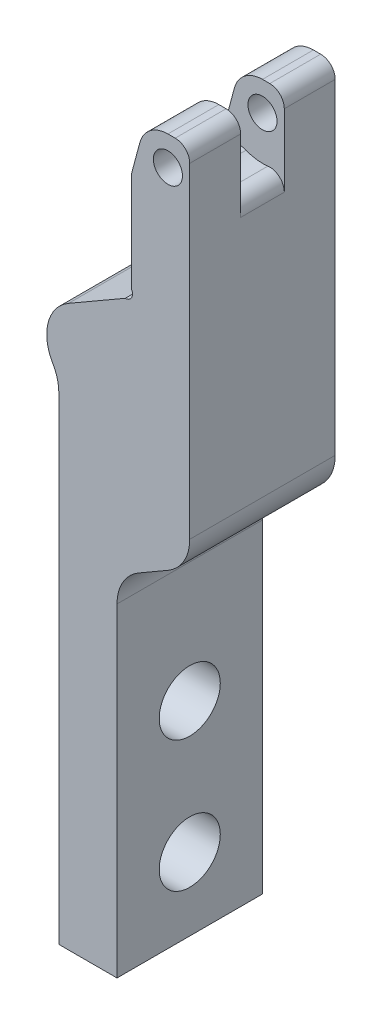
ISO-10303-21;
HEADER;
FILE_DESCRIPTION(('STEP AP214'),'2;1');
FILE_NAME('part.step','',(''),(''),'','','');
FILE_SCHEMA(('AUTOMOTIVE_DESIGN { 1 0 10303 214 1 1 1 1 }'));
ENDSEC;
DATA;
#1=APPLICATION_CONTEXT('core data for automotive mechanical design processes');
#2=APPLICATION_PROTOCOL_DEFINITION('international standard','automotive_design',2000,#1);
#3=PRODUCT_CONTEXT('',#1,'mechanical');
#4=PRODUCT('Part','Part','',(#3));
#5=PRODUCT_RELATED_PRODUCT_CATEGORY('part','',(#4));
#6=PRODUCT_DEFINITION_FORMATION('','',#4);
#7=PRODUCT_DEFINITION_CONTEXT('part definition',#1,'design');
#8=PRODUCT_DEFINITION('design','',#6,#7);
#9=PRODUCT_DEFINITION_SHAPE('','',#8);
#10=(LENGTH_UNIT() NAMED_UNIT(*) SI_UNIT(.MILLI.,.METRE.));
#11=(NAMED_UNIT(*) PLANE_ANGLE_UNIT() SI_UNIT($,.RADIAN.));
#12=(NAMED_UNIT(*) SI_UNIT($,.STERADIAN.) SOLID_ANGLE_UNIT());
#13=UNCERTAINTY_MEASURE_WITH_UNIT(LENGTH_MEASURE(1.E-05),#10,'distance_accuracy_value','');
#14=(GEOMETRIC_REPRESENTATION_CONTEXT(3) GLOBAL_UNCERTAINTY_ASSIGNED_CONTEXT((#13)) GLOBAL_UNIT_ASSIGNED_CONTEXT((#10,
#11,#12)) REPRESENTATION_CONTEXT('',''));
#15=CARTESIAN_POINT('',(0.,0.,0.));
#16=DIRECTION('',(0.,0.,1.));
#17=DIRECTION('',(1.,0.,0.));
#18=AXIS2_PLACEMENT_3D('',#15,#16,#17);
#19=CARTESIAN_POINT('',(5.,52.,5.));
#20=DIRECTION('',(0.,-1.,0.));
#21=DIRECTION('',(0.,0.,-1.));
#22=AXIS2_PLACEMENT_3D('',#19,#20,#21);
#23=PLANE('',#22);
#24=DIRECTION('',(-1.,0.,0.));
#25=VECTOR('',#24,1.);
#26=CARTESIAN_POINT('',(5.,52.,-1.5));
#27=LINE('',#26,#25);
#28=CARTESIAN_POINT('',(4.,52.,-1.5));
#29=VERTEX_POINT('',#28);
#30=CARTESIAN_POINT('',(3.5,52.,-1.5));
#31=VERTEX_POINT('',#30);
#32=EDGE_CURVE('E431',#29,#31,#27,.T.);
#33=ORIENTED_EDGE('',*,*,#32,.F.);
#34=DIRECTION('',(0.,0.,-1.));
#35=VECTOR('',#34,1.);
#36=CARTESIAN_POINT('',(4.,52.,5.));
#37=LINE('',#36,#35);
#38=CARTESIAN_POINT('',(4.,52.,-5.));
#39=VERTEX_POINT('',#38);
#40=EDGE_CURVE('E380',#29,#39,#37,.T.);
#41=ORIENTED_EDGE('',*,*,#40,.T.);
#42=DIRECTION('',(-1.,0.,0.));
#43=VECTOR('',#42,1.);
#44=CARTESIAN_POINT('',(5.,52.,-5.));
#45=LINE('',#44,#43);
#46=CARTESIAN_POINT('',(3.5,52.,-5.));
#47=VERTEX_POINT('',#46);
#48=EDGE_CURVE('E306',#39,#47,#45,.T.);
#49=ORIENTED_EDGE('',*,*,#48,.T.);
#50=DIRECTION('',(0.,0.,1.));
#51=VECTOR('',#50,1.);
#52=CARTESIAN_POINT('',(3.5,52.,-5.));
#53=LINE('',#52,#51);
#54=EDGE_CURVE('E235',#47,#31,#53,.T.);
#55=ORIENTED_EDGE('',*,*,#54,.T.);
#56=EDGE_LOOP('',(#33,#41,#49,#55));
#57=FACE_BOUND('',#56,.T.);
#58=ADVANCED_FACE('F35',(#57),#23,.F.);
#59=CARTESIAN_POINT('',(5.,26.8867513459481,5.));
#60=DIRECTION('',(-1.,0.,0.));
#61=DIRECTION('',(0.,-1.,0.));
#62=AXIS2_PLACEMENT_3D('',#59,#60,#61);
#63=PLANE('',#62);
#64=DIRECTION('',(0.,0.,1.));
#65=VECTOR('',#64,1.);
#66=CARTESIAN_POINT('',(5.,46.0313730334031,5.));
#67=LINE('',#66,#65);
#68=CARTESIAN_POINT('',(5.,46.0313730334031,-1.5));
#69=VERTEX_POINT('',#68);
#70=CARTESIAN_POINT('',(5.,46.0313730334031,1.5));
#71=VERTEX_POINT('',#70);
#72=EDGE_CURVE('E377',#69,#71,#67,.T.);
#73=ORIENTED_EDGE('',*,*,#72,.T.);
#74=DIRECTION('',(0.,1.,0.));
#75=VECTOR('',#74,1.);
#76=CARTESIAN_POINT('',(5.,26.8867513459481,1.5));
#77=LINE('',#76,#75);
#78=CARTESIAN_POINT('',(5.,51.,1.5));
#79=VERTEX_POINT('',#78);
#80=EDGE_CURVE('E218',#71,#79,#77,.T.);
#81=ORIENTED_EDGE('',*,*,#80,.T.);
#82=DIRECTION('',(0.,0.,-1.));
#83=VECTOR('',#82,1.);
#84=CARTESIAN_POINT('',(5.,51.,5.));
#85=LINE('',#84,#83);
#86=CARTESIAN_POINT('',(5.,51.,5.));
#87=VERTEX_POINT('',#86);
#88=EDGE_CURVE('E373',#79,#87,#85,.F.);
#89=ORIENTED_EDGE('',*,*,#88,.T.);
#90=DIRECTION('',(0.,1.,0.));
#91=VECTOR('',#90,1.);
#92=CARTESIAN_POINT('',(5.,26.8867513459481,5.));
#93=LINE('',#92,#91);
#94=CARTESIAN_POINT('',(5.,28.618802153517,5.));
#95=VERTEX_POINT('',#94);
#96=EDGE_CURVE('E279',#95,#87,#93,.T.);
#97=ORIENTED_EDGE('',*,*,#96,.F.);
#98=DIRECTION('',(0.,0.,-1.));
#99=VECTOR('',#98,1.);
#100=CARTESIAN_POINT('',(5.,28.618802153517,5.));
#101=LINE('',#100,#99);
#102=CARTESIAN_POINT('',(5.,28.618802153517,-5.));
#103=VERTEX_POINT('',#102);
#104=EDGE_CURVE('E355',#95,#103,#101,.T.);
#105=ORIENTED_EDGE('',*,*,#104,.T.);
#106=DIRECTION('',(0.,1.,0.));
#107=VECTOR('',#106,1.);
#108=CARTESIAN_POINT('',(5.,26.8867513459481,-5.));
#109=LINE('',#108,#107);
#110=CARTESIAN_POINT('',(5.,51.,-5.));
#111=VERTEX_POINT('',#110);
#112=EDGE_CURVE('E303',#103,#111,#109,.T.);
#113=ORIENTED_EDGE('',*,*,#112,.T.);
#114=DIRECTION('',(0.,0.,-1.));
#115=VECTOR('',#114,1.);
#116=CARTESIAN_POINT('',(5.,51.,5.));
#117=LINE('',#116,#115);
#118=CARTESIAN_POINT('',(5.,51.,-1.5));
#119=VERTEX_POINT('',#118);
#120=EDGE_CURVE('E375',#111,#119,#117,.F.);
#121=ORIENTED_EDGE('',*,*,#120,.T.);
#122=DIRECTION('',(0.,1.,0.));
#123=VECTOR('',#122,1.);
#124=CARTESIAN_POINT('',(5.,26.8867513459481,-1.5));
#125=LINE('',#124,#123);
#126=EDGE_CURVE('E416',#69,#119,#125,.T.);
#127=ORIENTED_EDGE('',*,*,#126,.F.);
#128=EDGE_LOOP('',(#73,#81,#89,#97,#105,#113,#121,#127));
#129=FACE_BOUND('',#128,.T.);
#130=ADVANCED_FACE('F451',(#129),#63,.F.);
#131=CARTESIAN_POINT('',(1.,41.,5.));
#132=DIRECTION('',(1.,0.,0.));
#133=DIRECTION('',(0.,0.,-1.));
#134=AXIS2_PLACEMENT_3D('',#131,#132,#133);
#135=PLANE('',#134);
#136=DIRECTION('',(0.,0.,1.));
#137=VECTOR('',#136,1.);
#138=CARTESIAN_POINT('',(1.,46.2919007564522,5.));
#139=LINE('',#138,#137);
#140=CARTESIAN_POINT('',(1.,46.2919007564522,1.5));
#141=VERTEX_POINT('',#140);
#142=CARTESIAN_POINT('',(1.,46.2919007564522,-1.5));
#143=VERTEX_POINT('',#142);
#144=EDGE_CURVE('E366',#141,#143,#139,.F.);
#145=ORIENTED_EDGE('',*,*,#144,.T.);
#146=DIRECTION('',(0.,-1.,0.));
#147=VECTOR('',#146,1.);
#148=CARTESIAN_POINT('',(1.,41.,-1.5));
#149=LINE('',#148,#147);
#150=CARTESIAN_POINT('',(1.,48.3972795913903,-1.5));
#151=VERTEX_POINT('',#150);
#152=EDGE_CURVE('E429',#151,#143,#149,.T.);
#153=ORIENTED_EDGE('',*,*,#152,.F.);
#154=DIRECTION('',(0.,0.,1.));
#155=VECTOR('',#154,1.);
#156=CARTESIAN_POINT('',(1.,48.3972795913903,-5.));
#157=LINE('',#156,#155);
#158=CARTESIAN_POINT('',(1.,48.3972795913903,-5.));
#159=VERTEX_POINT('',#158);
#160=EDGE_CURVE('E244',#159,#151,#157,.T.);
#161=ORIENTED_EDGE('',*,*,#160,.F.);
#162=DIRECTION('',(0.,-1.,0.));
#163=VECTOR('',#162,1.);
#164=CARTESIAN_POINT('',(1.,41.,-5.));
#165=LINE('',#164,#163);
#166=CARTESIAN_POINT('',(1.,41.5,-5.));
#167=VERTEX_POINT('',#166);
#168=EDGE_CURVE('E308',#159,#167,#165,.T.);
#169=ORIENTED_EDGE('',*,*,#168,.T.);
#170=DIRECTION('',(0.,0.,1.));
#171=VECTOR('',#170,1.);
#172=CARTESIAN_POINT('',(1.,41.5,-5.));
#173=LINE('',#172,#171);
#174=CARTESIAN_POINT('',(1.,41.5,5.));
#175=VERTEX_POINT('',#174);
#176=EDGE_CURVE('E260',#167,#175,#173,.T.);
#177=ORIENTED_EDGE('',*,*,#176,.T.);
#178=DIRECTION('',(0.,-1.,0.));
#179=VECTOR('',#178,1.);
#180=CARTESIAN_POINT('',(1.,41.,5.));
#181=LINE('',#180,#179);
#182=CARTESIAN_POINT('',(1.,48.3972795913903,5.));
#183=VERTEX_POINT('',#182);
#184=EDGE_CURVE('E284',#183,#175,#181,.T.);
#185=ORIENTED_EDGE('',*,*,#184,.F.);
#186=CARTESIAN_POINT('',(1.,48.3972795913903,1.5));
#187=VERTEX_POINT('',#186);
#188=EDGE_CURVE('E239',#187,#183,#157,.T.);
#189=ORIENTED_EDGE('',*,*,#188,.F.);
#190=DIRECTION('',(0.,-1.,0.));
#191=VECTOR('',#190,1.);
#192=CARTESIAN_POINT('',(1.,41.,1.5));
#193=LINE('',#192,#191);
#194=EDGE_CURVE('E219',#187,#141,#193,.T.);
#195=ORIENTED_EDGE('',*,*,#194,.T.);
#196=EDGE_LOOP('',(#145,#153,#161,#169,#177,#185,#189,#195));
#197=FACE_BOUND('',#196,.T.);
#198=ADVANCED_FACE('F482',(#197),#135,.F.);
#199=CARTESIAN_POINT('',(3.5,50.,-5.));
#200=DIRECTION('',(0.,0.,1.));
#201=DIRECTION('',(1.,0.,0.));
#202=AXIS2_PLACEMENT_3D('',#199,#200,#201);
#203=CYLINDRICAL_SURFACE('',#202,1.);
#204=CARTESIAN_POINT('',(3.5,50.,-5.));
#205=DIRECTION('',(0.,0.,1.));
#206=DIRECTION('',(1.,0.,0.));
#207=AXIS2_PLACEMENT_3D('',#204,#205,#206);
#208=CIRCLE('',#207,1.);
#209=CARTESIAN_POINT('',(4.5,50.,-5.));
#210=VERTEX_POINT('',#209);
#211=EDGE_CURVE('E251',#210,#210,#208,.T.);
#212=ORIENTED_EDGE('',*,*,#211,.F.);
#213=EDGE_LOOP('',(#212));
#214=FACE_BOUND('',#213,.T.);
#215=CARTESIAN_POINT('',(3.5,50.,-1.5));
#216=DIRECTION('',(0.,0.,1.));
#217=DIRECTION('',(1.,0.,0.));
#218=AXIS2_PLACEMENT_3D('',#215,#216,#217);
#219=CIRCLE('',#218,1.);
#220=CARTESIAN_POINT('',(4.5,50.,-1.5));
#221=VERTEX_POINT('',#220);
#222=EDGE_CURVE('E250',#221,#221,#219,.F.);
#223=ORIENTED_EDGE('',*,*,#222,.F.);
#224=EDGE_LOOP('',(#223));
#225=FACE_BOUND('',#224,.T.);
#226=ADVANCED_FACE('F560',(#214,#225),#203,.F.);
#227=CARTESIAN_POINT('',(1.56814834742186,50.517638090205,-5.));
#228=DIRECTION('',(0.96592582628907,-0.258819045102514,0.));
#229=DIRECTION('',(0.258819045102514,0.96592582628907,0.));
#230=AXIS2_PLACEMENT_3D('',#227,#228,#229);
#231=PLANE('',#230);
#232=DIRECTION('',(-0.258819045102514,-0.96592582628907,0.));
#233=VECTOR('',#232,1.);
#234=CARTESIAN_POINT('',(1.56814834742186,50.517638090205,-1.5));
#235=LINE('',#234,#233);
#236=CARTESIAN_POINT('',(1.56814834742186,50.517638090205,-1.5));
#237=VERTEX_POINT('',#236);
#238=EDGE_CURVE('E427',#237,#151,#235,.T.);
#239=ORIENTED_EDGE('',*,*,#238,.F.);
#240=DIRECTION('',(0.,0.,1.));
#241=VECTOR('',#240,1.);
#242=CARTESIAN_POINT('',(1.56814834742186,50.517638090205,-5.));
#243=LINE('',#242,#241);
#244=CARTESIAN_POINT('',(1.56814834742186,50.517638090205,-5.));
#245=VERTEX_POINT('',#244);
#246=EDGE_CURVE('E236',#245,#237,#243,.T.);
#247=ORIENTED_EDGE('',*,*,#246,.F.);
#248=DIRECTION('',(0.258819045102514,0.96592582628907,0.));
#249=VECTOR('',#248,1.);
#250=CARTESIAN_POINT('',(1.56814834742186,50.517638090205,-5.));
#251=LINE('',#250,#249);
#252=EDGE_CURVE('E436',#159,#245,#251,.T.);
#253=ORIENTED_EDGE('',*,*,#252,.F.);
#254=ORIENTED_EDGE('',*,*,#160,.T.);
#255=EDGE_LOOP('',(#239,#247,#253,#254));
#256=FACE_BOUND('',#255,.T.);
#257=ADVANCED_FACE('F477',(#256),#231,.F.);
#258=CARTESIAN_POINT('',(3.5,50.,-5.));
#259=DIRECTION('',(0.,0.,1.));
#260=DIRECTION('',(1.,0.,0.));
#261=AXIS2_PLACEMENT_3D('',#258,#259,#260);
#262=CYLINDRICAL_SURFACE('',#261,2.);
#263=CARTESIAN_POINT('',(3.5,50.,-1.5));
#264=DIRECTION('',(0.,0.,1.));
#265=DIRECTION('',(1.,0.,0.));
#266=AXIS2_PLACEMENT_3D('',#263,#264,#265);
#267=CIRCLE('',#266,2.);
#268=EDGE_CURVE('E229',#31,#237,#267,.T.);
#269=ORIENTED_EDGE('',*,*,#268,.F.);
#270=ORIENTED_EDGE('',*,*,#54,.F.);
#271=CARTESIAN_POINT('',(3.5,50.,-5.));
#272=DIRECTION('',(0.,0.,-1.));
#273=DIRECTION('',(-1.,0.,0.));
#274=AXIS2_PLACEMENT_3D('',#271,#272,#273);
#275=CIRCLE('',#274,2.);
#276=EDGE_CURVE('E439',#245,#47,#275,.T.);
#277=ORIENTED_EDGE('',*,*,#276,.F.);
#278=ORIENTED_EDGE('',*,*,#246,.T.);
#279=EDGE_LOOP('',(#269,#270,#277,#278));
#280=FACE_BOUND('',#279,.T.);
#281=ADVANCED_FACE('F474',(#280),#262,.T.);
#282=DIRECTION('',(-1.,0.,0.));
#283=VECTOR('',#282,1.);
#284=CARTESIAN_POINT('',(5.,52.,5.));
#285=LINE('',#284,#283);
#286=CARTESIAN_POINT('',(4.,52.,5.));
#287=VERTEX_POINT('',#286);
#288=CARTESIAN_POINT('',(3.5,52.,5.));
#289=VERTEX_POINT('',#288);
#290=EDGE_CURVE('E282',#287,#289,#285,.T.);
#291=ORIENTED_EDGE('',*,*,#290,.F.);
#292=DIRECTION('',(0.,0.,-1.));
#293=VECTOR('',#292,1.);
#294=CARTESIAN_POINT('',(4.,52.,5.));
#295=LINE('',#294,#293);
#296=CARTESIAN_POINT('',(4.,52.,1.5));
#297=VERTEX_POINT('',#296);
#298=EDGE_CURVE('E216',#287,#297,#295,.T.);
#299=ORIENTED_EDGE('',*,*,#298,.T.);
#300=DIRECTION('',(-1.,0.,0.));
#301=VECTOR('',#300,1.);
#302=CARTESIAN_POINT('',(5.,52.,1.5));
#303=LINE('',#302,#301);
#304=CARTESIAN_POINT('',(3.5,52.,1.5));
#305=VERTEX_POINT('',#304);
#306=EDGE_CURVE('E210',#297,#305,#303,.T.);
#307=ORIENTED_EDGE('',*,*,#306,.T.);
#308=EDGE_CURVE('E214',#305,#289,#53,.T.);
#309=ORIENTED_EDGE('',*,*,#308,.T.);
#310=EDGE_LOOP('',(#291,#299,#307,#309));
#311=FACE_BOUND('',#310,.T.);
#312=ADVANCED_FACE('F212',(#311),#23,.F.);
#313=CARTESIAN_POINT('',(0.,24.,5.));
#314=DIRECTION('',(-0.499999999999999,0.866025403784439,0.));
#315=DIRECTION('',(-0.866025403784439,-0.499999999999999,0.));
#316=AXIS2_PLACEMENT_3D('',#313,#314,#315);
#317=PLANE('',#316);
#318=DIRECTION('',(0.866025403784439,0.499999999999999,0.));
#319=VECTOR('',#318,1.);
#320=CARTESIAN_POINT('',(0.,24.,5.));
#321=LINE('',#320,#319);
#322=CARTESIAN_POINT('',(1.5,24.8660254037844,5.));
#323=VERTEX_POINT('',#322);
#324=CARTESIAN_POINT('',(3.5,26.0207259421637,5.));
#325=VERTEX_POINT('',#324);
#326=EDGE_CURVE('E276',#323,#325,#321,.T.);
#327=ORIENTED_EDGE('',*,*,#326,.F.);
#328=DIRECTION('',(0.,0.,-1.));
#329=VECTOR('',#328,1.);
#330=CARTESIAN_POINT('',(1.5,24.8660254037844,-5.));
#331=LINE('',#330,#329);
#332=CARTESIAN_POINT('',(1.5,24.8660254037844,-5.));
#333=VERTEX_POINT('',#332);
#334=EDGE_CURVE('E350',#323,#333,#331,.T.);
#335=ORIENTED_EDGE('',*,*,#334,.T.);
#336=DIRECTION('',(0.866025403784439,0.499999999999999,0.));
#337=VECTOR('',#336,1.);
#338=CARTESIAN_POINT('',(0.,24.,-5.));
#339=LINE('',#338,#337);
#340=CARTESIAN_POINT('',(3.5,26.0207259421637,-5.));
#341=VERTEX_POINT('',#340);
#342=EDGE_CURVE('E275',#333,#341,#339,.T.);
#343=ORIENTED_EDGE('',*,*,#342,.T.);
#344=DIRECTION('',(0.,0.,-1.));
#345=VECTOR('',#344,1.);
#346=CARTESIAN_POINT('',(3.5,26.0207259421637,5.));
#347=LINE('',#346,#345);
#348=EDGE_CURVE('E348',#341,#325,#347,.F.);
#349=ORIENTED_EDGE('',*,*,#348,.T.);
#350=EDGE_LOOP('',(#327,#335,#343,#349));
#351=FACE_BOUND('',#350,.T.);
#352=ADVANCED_FACE('F527',(#351),#317,.F.);
#353=CARTESIAN_POINT('',(-5.92820323027552,37.,5.));
#354=DIRECTION('',(0.499999999999998,-0.86602540378444,0.));
#355=DIRECTION('',(0.86602540378444,0.499999999999998,0.));
#356=AXIS2_PLACEMENT_3D('',#353,#354,#355);
#357=PLANE('',#356);
#358=DIRECTION('',(-0.86602540378444,-0.499999999999998,0.));
#359=VECTOR('',#358,1.);
#360=CARTESIAN_POINT('',(-5.92820323027552,37.,-5.));
#361=LINE('',#360,#359);
#362=CARTESIAN_POINT('',(0.566987298107779,40.75,-5.));
#363=VERTEX_POINT('',#362);
#364=CARTESIAN_POINT('',(-3.3301270189222,38.5,-5.));
#365=VERTEX_POINT('',#364);
#366=EDGE_CURVE('E311',#363,#365,#361,.T.);
#367=ORIENTED_EDGE('',*,*,#366,.T.);
#368=DIRECTION('',(0.,0.,-1.));
#369=VECTOR('',#368,1.);
#370=CARTESIAN_POINT('',(-3.3301270189222,38.5,5.));
#371=LINE('',#370,#369);
#372=CARTESIAN_POINT('',(-3.3301270189222,38.5,5.));
#373=VERTEX_POINT('',#372);
#374=EDGE_CURVE('E339',#365,#373,#371,.F.);
#375=ORIENTED_EDGE('',*,*,#374,.T.);
#376=DIRECTION('',(-0.86602540378444,-0.499999999999998,0.));
#377=VECTOR('',#376,1.);
#378=CARTESIAN_POINT('',(-5.92820323027552,37.,5.));
#379=LINE('',#378,#377);
#380=CARTESIAN_POINT('',(0.566987298107779,40.75,5.));
#381=VERTEX_POINT('',#380);
#382=EDGE_CURVE('E287',#381,#373,#379,.T.);
#383=ORIENTED_EDGE('',*,*,#382,.F.);
#384=DIRECTION('',(0.,0.,1.));
#385=VECTOR('',#384,1.);
#386=CARTESIAN_POINT('',(0.566987298107779,40.75,-5.));
#387=LINE('',#386,#385);
#388=EDGE_CURVE('E254',#381,#363,#387,.F.);
#389=ORIENTED_EDGE('',*,*,#388,.T.);
#390=EDGE_LOOP('',(#367,#375,#383,#389));
#391=FACE_BOUND('',#390,.T.);
#392=ADVANCED_FACE('F495',(#391),#357,.F.);
#393=CARTESIAN_POINT('',(-5.92820323027552,37.,5.));
#394=DIRECTION('',(0.86602540378444,0.499999999999998,0.));
#395=DIRECTION('',(-0.499999999999998,0.86602540378444,0.));
#396=AXIS2_PLACEMENT_3D('',#393,#394,#395);
#397=PLANE('',#396);
#398=DIRECTION('',(0.499999999999998,-0.86602540378444,0.));
#399=VECTOR('',#398,1.);
#400=CARTESIAN_POINT('',(-5.92820323027552,37.,5.));
#401=LINE('',#400,#399);
#402=CARTESIAN_POINT('',(-4.42820323027552,34.4019237886467,5.));
#403=VERTEX_POINT('',#402);
#404=CARTESIAN_POINT('',(-4.40192378864669,34.356406460551,5.));
#405=VERTEX_POINT('',#404);
#406=EDGE_CURVE('E290',#403,#405,#401,.T.);
#407=ORIENTED_EDGE('',*,*,#406,.F.);
#408=DIRECTION('',(0.,0.,-1.));
#409=VECTOR('',#408,1.);
#410=CARTESIAN_POINT('',(-4.42820323027552,34.4019237886467,5.));
#411=LINE('',#410,#409);
#412=CARTESIAN_POINT('',(-4.42820323027552,34.4019237886467,-5.));
#413=VERTEX_POINT('',#412);
#414=EDGE_CURVE('E332',#403,#413,#411,.T.);
#415=ORIENTED_EDGE('',*,*,#414,.T.);
#416=DIRECTION('',(0.499999999999998,-0.86602540378444,0.));
#417=VECTOR('',#416,1.);
#418=CARTESIAN_POINT('',(-5.92820323027552,37.,-5.));
#419=LINE('',#418,#417);
#420=CARTESIAN_POINT('',(-4.40192378864669,34.356406460551,-5.));
#421=VERTEX_POINT('',#420);
#422=EDGE_CURVE('E314',#413,#421,#419,.T.);
#423=ORIENTED_EDGE('',*,*,#422,.T.);
#424=DIRECTION('',(0.,0.,-1.));
#425=VECTOR('',#424,1.);
#426=CARTESIAN_POINT('',(-4.40192378864669,34.356406460551,5.));
#427=LINE('',#426,#425);
#428=EDGE_CURVE('E330',#421,#405,#427,.F.);
#429=ORIENTED_EDGE('',*,*,#428,.T.);
#430=EDGE_LOOP('',(#407,#415,#423,#429));
#431=FACE_BOUND('',#430,.T.);
#432=ADVANCED_FACE('F503',(#431),#397,.F.);
#433=CARTESIAN_POINT('',(-4.,33.6602540378444,5.));
#434=DIRECTION('',(1.,0.,0.));
#435=DIRECTION('',(0.,1.,0.));
#436=AXIS2_PLACEMENT_3D('',#433,#434,#435);
#437=PLANE('',#436);
#438=CARTESIAN_POINT('',(-4.,14.,0.));
#439=DIRECTION('',(1.,0.,0.));
#440=DIRECTION('',(0.,1.,0.));
#441=AXIS2_PLACEMENT_3D('',#438,#439,#440);
#442=CIRCLE('',#441,2.1);
#443=CARTESIAN_POINT('',(-4.,16.1,0.));
#444=VERTEX_POINT('',#443);
#445=EDGE_CURVE('E272',#444,#444,#442,.T.);
#446=ORIENTED_EDGE('',*,*,#445,.T.);
#447=EDGE_LOOP('',(#446));
#448=FACE_BOUND('',#447,.T.);
#449=CARTESIAN_POINT('',(-4.,5.,0.));
#450=DIRECTION('',(1.,0.,0.));
#451=DIRECTION('',(0.,1.,0.));
#452=AXIS2_PLACEMENT_3D('',#449,#450,#451);
#453=CIRCLE('',#452,2.1);
#454=CARTESIAN_POINT('',(-4.,7.1,0.));
#455=VERTEX_POINT('',#454);
#456=EDGE_CURVE('E267',#455,#455,#453,.T.);
#457=ORIENTED_EDGE('',*,*,#456,.T.);
#458=EDGE_LOOP('',(#457));
#459=FACE_BOUND('',#458,.T.);
#460=DIRECTION('',(0.,-1.,0.));
#461=VECTOR('',#460,1.);
#462=CARTESIAN_POINT('',(-4.,33.6602540378444,5.));
#463=LINE('',#462,#461);
#464=CARTESIAN_POINT('',(-4.,32.856406460551,5.));
#465=VERTEX_POINT('',#464);
#466=CARTESIAN_POINT('',(-4.,0.,5.));
#467=VERTEX_POINT('',#466);
#468=EDGE_CURVE('E293',#465,#467,#463,.T.);
#469=ORIENTED_EDGE('',*,*,#468,.F.);
#470=DIRECTION('',(0.,0.,-1.));
#471=VECTOR('',#470,1.);
#472=CARTESIAN_POINT('',(-4.,32.856406460551,-5.));
#473=LINE('',#472,#471);
#474=CARTESIAN_POINT('',(-4.,32.856406460551,-5.));
#475=VERTEX_POINT('',#474);
#476=EDGE_CURVE('E345',#465,#475,#473,.T.);
#477=ORIENTED_EDGE('',*,*,#476,.T.);
#478=DIRECTION('',(0.,-1.,0.));
#479=VECTOR('',#478,1.);
#480=CARTESIAN_POINT('',(-4.,33.6602540378444,-5.));
#481=LINE('',#480,#479);
#482=CARTESIAN_POINT('',(-4.,0.,-5.));
#483=VERTEX_POINT('',#482);
#484=EDGE_CURVE('E317',#475,#483,#481,.T.);
#485=ORIENTED_EDGE('',*,*,#484,.T.);
#486=DIRECTION('',(0.,0.,-1.));
#487=VECTOR('',#486,1.);
#488=CARTESIAN_POINT('',(-4.,0.,5.));
#489=LINE('',#488,#487);
#490=EDGE_CURVE('E325',#467,#483,#489,.T.);
#491=ORIENTED_EDGE('',*,*,#490,.F.);
#492=EDGE_LOOP('',(#469,#477,#485,#491));
#493=FACE_BOUND('',#492,.T.);
#494=ADVANCED_FACE('F512',(#448,#459,#493),#437,.F.);
#495=CARTESIAN_POINT('',(-4.,0.,5.));
#496=DIRECTION('',(0.,1.,0.));
#497=DIRECTION('',(0.,0.,1.));
#498=AXIS2_PLACEMENT_3D('',#495,#496,#497);
#499=PLANE('',#498);
#500=DIRECTION('',(1.,0.,0.));
#501=VECTOR('',#500,1.);
#502=CARTESIAN_POINT('',(-4.,0.,-5.));
#503=LINE('',#502,#501);
#504=CARTESIAN_POINT('',(0.,0.,-5.));
#505=VERTEX_POINT('',#504);
#506=EDGE_CURVE('E319',#483,#505,#503,.T.);
#507=ORIENTED_EDGE('',*,*,#506,.T.);
#508=DIRECTION('',(0.,0.,-1.));
#509=VECTOR('',#508,1.);
#510=CARTESIAN_POINT('',(0.,0.,5.));
#511=LINE('',#510,#509);
#512=CARTESIAN_POINT('',(0.,0.,5.));
#513=VERTEX_POINT('',#512);
#514=EDGE_CURVE('E300',#513,#505,#511,.T.);
#515=ORIENTED_EDGE('',*,*,#514,.F.);
#516=DIRECTION('',(1.,0.,0.));
#517=VECTOR('',#516,1.);
#518=CARTESIAN_POINT('',(-4.,0.,5.));
#519=LINE('',#518,#517);
#520=EDGE_CURVE('E295',#467,#513,#519,.T.);
#521=ORIENTED_EDGE('',*,*,#520,.F.);
#522=ORIENTED_EDGE('',*,*,#490,.T.);
#523=EDGE_LOOP('',(#507,#515,#521,#522));
#524=FACE_BOUND('',#523,.T.);
#525=ADVANCED_FACE('F518',(#524),#499,.F.);
#526=CARTESIAN_POINT('',(0.,0.,5.));
#527=DIRECTION('',(-1.,0.,0.));
#528=DIRECTION('',(0.,0.,1.));
#529=AXIS2_PLACEMENT_3D('',#526,#527,#528);
#530=PLANE('',#529);
#531=CARTESIAN_POINT('',(0.,14.,0.));
#532=DIRECTION('',(1.,0.,0.));
#533=DIRECTION('',(0.,0.,-1.));
#534=AXIS2_PLACEMENT_3D('',#531,#532,#533);
#535=CIRCLE('',#534,2.1);
#536=CARTESIAN_POINT('',(0.,14.,-2.1));
#537=VERTEX_POINT('',#536);
#538=EDGE_CURVE('E264',#537,#537,#535,.T.);
#539=ORIENTED_EDGE('',*,*,#538,.F.);
#540=EDGE_LOOP('',(#539));
#541=FACE_BOUND('',#540,.T.);
#542=CARTESIAN_POINT('',(0.,5.,0.));
#543=DIRECTION('',(1.,0.,0.));
#544=DIRECTION('',(0.,0.,-1.));
#545=AXIS2_PLACEMENT_3D('',#542,#543,#544);
#546=CIRCLE('',#545,2.1);
#547=CARTESIAN_POINT('',(0.,5.,-2.1));
#548=VERTEX_POINT('',#547);
#549=EDGE_CURVE('E263',#548,#548,#546,.T.);
#550=ORIENTED_EDGE('',*,*,#549,.F.);
#551=EDGE_LOOP('',(#550));
#552=FACE_BOUND('',#551,.T.);
#553=DIRECTION('',(0.,1.,0.));
#554=VECTOR('',#553,1.);
#555=CARTESIAN_POINT('',(0.,0.,-5.));
#556=LINE('',#555,#554);
#557=CARTESIAN_POINT('',(0.,22.2679491924311,-5.));
#558=VERTEX_POINT('',#557);
#559=EDGE_CURVE('E280',#505,#558,#556,.T.);
#560=ORIENTED_EDGE('',*,*,#559,.T.);
#561=DIRECTION('',(0.,0.,-1.));
#562=VECTOR('',#561,1.);
#563=CARTESIAN_POINT('',(0.,22.2679491924311,5.));
#564=LINE('',#563,#562);
#565=CARTESIAN_POINT('',(0.,22.2679491924311,5.));
#566=VERTEX_POINT('',#565);
#567=EDGE_CURVE('E353',#558,#566,#564,.F.);
#568=ORIENTED_EDGE('',*,*,#567,.T.);
#569=DIRECTION('',(0.,1.,0.));
#570=VECTOR('',#569,1.);
#571=CARTESIAN_POINT('',(0.,0.,5.));
#572=LINE('',#571,#570);
#573=EDGE_CURVE('E297',#513,#566,#572,.T.);
#574=ORIENTED_EDGE('',*,*,#573,.F.);
#575=ORIENTED_EDGE('',*,*,#514,.T.);
#576=EDGE_LOOP('',(#560,#568,#574,#575));
#577=FACE_BOUND('',#576,.T.);
#578=ADVANCED_FACE('F529',(#541,#552,#577),#530,.F.);
#579=CARTESIAN_POINT('',(0.,0.,5.));
#580=DIRECTION('',(0.,0.,-1.));
#581=DIRECTION('',(-1.,0.,0.));
#582=AXIS2_PLACEMENT_3D('',#579,#580,#581);
#583=PLANE('',#582);
#584=CARTESIAN_POINT('',(3.5,50.,5.));
#585=DIRECTION('',(0.,0.,1.));
#586=DIRECTION('',(1.,0.,0.));
#587=AXIS2_PLACEMENT_3D('',#584,#585,#586);
#588=CIRCLE('',#587,1.);
#589=CARTESIAN_POINT('',(4.5,50.,5.));
#590=VERTEX_POINT('',#589);
#591=EDGE_CURVE('E255',#590,#590,#588,.T.);
#592=ORIENTED_EDGE('',*,*,#591,.F.);
#593=EDGE_LOOP('',(#592));
#594=FACE_BOUND('',#593,.T.);
#595=ORIENTED_EDGE('',*,*,#96,.T.);
#596=CARTESIAN_POINT('',(4.,51.,5.));
#597=DIRECTION('',(0.,0.,-1.));
#598=DIRECTION('',(-1.,0.,0.));
#599=AXIS2_PLACEMENT_3D('',#596,#597,#598);
#600=CIRCLE('',#599,1.);
#601=EDGE_CURVE('E50',#87,#287,#600,.F.);
#602=ORIENTED_EDGE('',*,*,#601,.T.);
#603=ORIENTED_EDGE('',*,*,#290,.T.);
#604=CARTESIAN_POINT('',(3.5,50.,5.));
#605=DIRECTION('',(0.,0.,-1.));
#606=DIRECTION('',(-1.,0.,0.));
#607=AXIS2_PLACEMENT_3D('',#604,#605,#606);
#608=CIRCLE('',#607,2.);
#609=CARTESIAN_POINT('',(1.56814834742186,50.517638090205,5.));
#610=VERTEX_POINT('',#609);
#611=EDGE_CURVE('E234',#610,#289,#608,.T.);
#612=ORIENTED_EDGE('',*,*,#611,.F.);
#613=DIRECTION('',(0.258819045102514,0.96592582628907,0.));
#614=VECTOR('',#613,1.);
#615=CARTESIAN_POINT('',(1.56814834742186,50.517638090205,5.));
#616=LINE('',#615,#614);
#617=EDGE_CURVE('E249',#183,#610,#616,.T.);
#618=ORIENTED_EDGE('',*,*,#617,.F.);
#619=ORIENTED_EDGE('',*,*,#184,.T.);
#620=CARTESIAN_POINT('',(0.566987298107782,41.25,5.));
#621=DIRECTION('',(0.,0.,1.));
#622=DIRECTION('',(1.,0.,0.));
#623=AXIS2_PLACEMENT_3D('',#620,#621,#622);
#624=CIRCLE('',#623,0.500000000000001);
#625=EDGE_CURVE('E247',#381,#175,#624,.T.);
#626=ORIENTED_EDGE('',*,*,#625,.F.);
#627=ORIENTED_EDGE('',*,*,#382,.T.);
#628=CARTESIAN_POINT('',(-1.8301270189222,35.9019237886467,5.));
#629=DIRECTION('',(0.,0.,-1.));
#630=DIRECTION('',(-1.,0.,0.));
#631=AXIS2_PLACEMENT_3D('',#628,#629,#630);
#632=CIRCLE('',#631,3.);
#633=EDGE_CURVE('E343',#373,#403,#632,.F.);
#634=ORIENTED_EDGE('',*,*,#633,.T.);
#635=ORIENTED_EDGE('',*,*,#406,.T.);
#636=CARTESIAN_POINT('',(-7.,32.856406460551,5.));
#637=DIRECTION('',(0.,0.,-1.));
#638=DIRECTION('',(-1.,0.,0.));
#639=AXIS2_PLACEMENT_3D('',#636,#637,#638);
#640=CIRCLE('',#639,3.);
#641=EDGE_CURVE('E360',#405,#465,#640,.T.);
#642=ORIENTED_EDGE('',*,*,#641,.T.);
#643=ORIENTED_EDGE('',*,*,#468,.T.);
#644=ORIENTED_EDGE('',*,*,#520,.T.);
#645=ORIENTED_EDGE('',*,*,#573,.T.);
#646=CARTESIAN_POINT('',(3.,22.2679491924311,5.));
#647=DIRECTION('',(0.,0.,-1.));
#648=DIRECTION('',(-1.,0.,0.));
#649=AXIS2_PLACEMENT_3D('',#646,#647,#648);
#650=CIRCLE('',#649,3.);
#651=EDGE_CURVE('E364',#566,#323,#650,.T.);
#652=ORIENTED_EDGE('',*,*,#651,.T.);
#653=ORIENTED_EDGE('',*,*,#326,.T.);
#654=CARTESIAN_POINT('',(2.,28.618802153517,5.));
#655=DIRECTION('',(0.,0.,-1.));
#656=DIRECTION('',(-1.,0.,0.));
#657=AXIS2_PLACEMENT_3D('',#654,#655,#656);
#658=CIRCLE('',#657,3.);
#659=EDGE_CURVE('E341',#325,#95,#658,.F.);
#660=ORIENTED_EDGE('',*,*,#659,.T.);
#661=EDGE_LOOP('',(#595,#602,#603,#612,#618,#619,#626,#627,#634,#635,#642,#643,#644,#645,#652,
#653,#660));
#662=FACE_BOUND('',#661,.T.);
#663=ADVANCED_FACE('F448',(#594,#662),#583,.F.);
#664=CARTESIAN_POINT('',(0.,0.,-5.));
#665=DIRECTION('',(0.,0.,-1.));
#666=DIRECTION('',(-1.,0.,0.));
#667=AXIS2_PLACEMENT_3D('',#664,#665,#666);
#668=PLANE('',#667);
#669=ORIENTED_EDGE('',*,*,#48,.F.);
#670=CARTESIAN_POINT('',(4.,51.,-5.));
#671=DIRECTION('',(0.,0.,-1.));
#672=DIRECTION('',(-1.,0.,0.));
#673=AXIS2_PLACEMENT_3D('',#670,#671,#672);
#674=CIRCLE('',#673,1.);
#675=EDGE_CURVE('E383',#39,#111,#674,.T.);
#676=ORIENTED_EDGE('',*,*,#675,.T.);
#677=ORIENTED_EDGE('',*,*,#112,.F.);
#678=CARTESIAN_POINT('',(2.,28.618802153517,-5.));
#679=DIRECTION('',(0.,0.,-1.));
#680=DIRECTION('',(-1.,0.,0.));
#681=AXIS2_PLACEMENT_3D('',#678,#679,#680);
#682=CIRCLE('',#681,3.);
#683=EDGE_CURVE('E335',#103,#341,#682,.T.);
#684=ORIENTED_EDGE('',*,*,#683,.T.);
#685=ORIENTED_EDGE('',*,*,#342,.F.);
#686=CARTESIAN_POINT('',(3.,22.2679491924311,-5.));
#687=DIRECTION('',(0.,0.,-1.));
#688=DIRECTION('',(-1.,0.,0.));
#689=AXIS2_PLACEMENT_3D('',#686,#687,#688);
#690=CIRCLE('',#689,3.);
#691=EDGE_CURVE('E362',#333,#558,#690,.F.);
#692=ORIENTED_EDGE('',*,*,#691,.T.);
#693=ORIENTED_EDGE('',*,*,#559,.F.);
#694=ORIENTED_EDGE('',*,*,#506,.F.);
#695=ORIENTED_EDGE('',*,*,#484,.F.);
#696=CARTESIAN_POINT('',(-7.,32.856406460551,-5.));
#697=DIRECTION('',(0.,0.,-1.));
#698=DIRECTION('',(-1.,0.,0.));
#699=AXIS2_PLACEMENT_3D('',#696,#697,#698);
#700=CIRCLE('',#699,3.);
#701=EDGE_CURVE('E358',#475,#421,#700,.F.);
#702=ORIENTED_EDGE('',*,*,#701,.T.);
#703=ORIENTED_EDGE('',*,*,#422,.F.);
#704=CARTESIAN_POINT('',(-1.8301270189222,35.9019237886467,-5.));
#705=DIRECTION('',(0.,0.,-1.));
#706=DIRECTION('',(-1.,0.,0.));
#707=AXIS2_PLACEMENT_3D('',#704,#705,#706);
#708=CIRCLE('',#707,3.);
#709=EDGE_CURVE('E337',#413,#365,#708,.T.);
#710=ORIENTED_EDGE('',*,*,#709,.T.);
#711=ORIENTED_EDGE('',*,*,#366,.F.);
#712=CARTESIAN_POINT('',(0.566987298107782,41.25,-5.));
#713=DIRECTION('',(0.,0.,-1.));
#714=DIRECTION('',(-1.,0.,0.));
#715=AXIS2_PLACEMENT_3D('',#712,#713,#714);
#716=CIRCLE('',#715,0.500000000000001);
#717=EDGE_CURVE('E230',#167,#363,#716,.T.);
#718=ORIENTED_EDGE('',*,*,#717,.F.);
#719=ORIENTED_EDGE('',*,*,#168,.F.);
#720=ORIENTED_EDGE('',*,*,#252,.T.);
#721=ORIENTED_EDGE('',*,*,#276,.T.);
#722=EDGE_LOOP('',(#669,#676,#677,#684,#685,#692,#693,#694,#695,#702,#703,#710,#711,#718,#719,
#720,#721));
#723=FACE_BOUND('',#722,.T.);
#724=ORIENTED_EDGE('',*,*,#211,.T.);
#725=EDGE_LOOP('',(#724));
#726=FACE_BOUND('',#725,.T.);
#727=ADVANCED_FACE('F462',(#723,#726),#668,.T.);
#728=CARTESIAN_POINT('',(-5.92820323027552,5.,0.));
#729=DIRECTION('',(1.,0.,0.));
#730=DIRECTION('',(0.,0.,-1.));
#731=AXIS2_PLACEMENT_3D('',#728,#729,#730);
#732=CYLINDRICAL_SURFACE('',#731,2.1);
#733=ORIENTED_EDGE('',*,*,#549,.T.);
#734=EDGE_LOOP('',(#733));
#735=FACE_BOUND('',#734,.T.);
#736=ORIENTED_EDGE('',*,*,#456,.F.);
#737=EDGE_LOOP('',(#736));
#738=FACE_BOUND('',#737,.T.);
#739=ADVANCED_FACE('F579',(#735,#738),#732,.F.);
#740=CARTESIAN_POINT('',(-5.92820323027552,14.,0.));
#741=DIRECTION('',(1.,0.,0.));
#742=DIRECTION('',(0.,0.,-1.));
#743=AXIS2_PLACEMENT_3D('',#740,#741,#742);
#744=CYLINDRICAL_SURFACE('',#743,2.1);
#745=ORIENTED_EDGE('',*,*,#538,.T.);
#746=EDGE_LOOP('',(#745));
#747=FACE_BOUND('',#746,.T.);
#748=ORIENTED_EDGE('',*,*,#445,.F.);
#749=EDGE_LOOP('',(#748));
#750=FACE_BOUND('',#749,.T.);
#751=ADVANCED_FACE('F573',(#747,#750),#744,.F.);
#752=CARTESIAN_POINT('',(3.5,50.,1.5));
#753=DIRECTION('',(0.,0.,1.));
#754=DIRECTION('',(1.,0.,0.));
#755=AXIS2_PLACEMENT_3D('',#752,#753,#754);
#756=CIRCLE('',#755,1.);
#757=CARTESIAN_POINT('',(4.5,50.,1.5));
#758=VERTEX_POINT('',#757);
#759=EDGE_CURVE('E424',#758,#758,#756,.F.);
#760=ORIENTED_EDGE('',*,*,#759,.T.);
#761=EDGE_LOOP('',(#760));
#762=FACE_BOUND('',#761,.T.);
#763=ORIENTED_EDGE('',*,*,#591,.T.);
#764=EDGE_LOOP('',(#763));
#765=FACE_BOUND('',#764,.T.);
#766=ADVANCED_FACE('F569',(#762,#765),#203,.F.);
#767=CARTESIAN_POINT('',(1.56814834742186,50.517638090205,1.5));
#768=VERTEX_POINT('',#767);
#769=EDGE_CURVE('E241',#768,#610,#243,.T.);
#770=ORIENTED_EDGE('',*,*,#769,.F.);
#771=DIRECTION('',(-0.258819045102514,-0.96592582628907,0.));
#772=VECTOR('',#771,1.);
#773=CARTESIAN_POINT('',(1.56814834742186,50.517638090205,1.5));
#774=LINE('',#773,#772);
#775=EDGE_CURVE('E226',#768,#187,#774,.T.);
#776=ORIENTED_EDGE('',*,*,#775,.T.);
#777=ORIENTED_EDGE('',*,*,#188,.T.);
#778=ORIENTED_EDGE('',*,*,#617,.T.);
#779=EDGE_LOOP('',(#770,#776,#777,#778));
#780=FACE_BOUND('',#779,.T.);
#781=ADVANCED_FACE('F445',(#780),#231,.F.);
#782=ORIENTED_EDGE('',*,*,#308,.F.);
#783=CARTESIAN_POINT('',(3.5,50.,1.5));
#784=DIRECTION('',(0.,0.,1.));
#785=DIRECTION('',(1.,0.,0.));
#786=AXIS2_PLACEMENT_3D('',#783,#784,#785);
#787=CIRCLE('',#786,2.);
#788=EDGE_CURVE('E222',#305,#768,#787,.T.);
#789=ORIENTED_EDGE('',*,*,#788,.T.);
#790=ORIENTED_EDGE('',*,*,#769,.T.);
#791=ORIENTED_EDGE('',*,*,#611,.T.);
#792=EDGE_LOOP('',(#782,#789,#790,#791));
#793=FACE_BOUND('',#792,.T.);
#794=ADVANCED_FACE('F232',(#793),#262,.T.);
#795=CARTESIAN_POINT('',(0.566987298107782,41.25,-5.));
#796=DIRECTION('',(0.,0.,1.));
#797=DIRECTION('',(1.,0.,0.));
#798=AXIS2_PLACEMENT_3D('',#795,#796,#797);
#799=CYLINDRICAL_SURFACE('',#798,0.500000000000001);
#800=ORIENTED_EDGE('',*,*,#176,.F.);
#801=ORIENTED_EDGE('',*,*,#717,.T.);
#802=ORIENTED_EDGE('',*,*,#388,.F.);
#803=ORIENTED_EDGE('',*,*,#625,.T.);
#804=EDGE_LOOP('',(#800,#801,#802,#803));
#805=FACE_BOUND('',#804,.T.);
#806=ADVANCED_FACE('F492',(#805),#799,.F.);
#807=CARTESIAN_POINT('',(3.5,50.,-1.5));
#808=DIRECTION('',(0.,0.,1.));
#809=DIRECTION('',(1.,0.,0.));
#810=AXIS2_PLACEMENT_3D('',#807,#808,#809);
#811=CYLINDRICAL_SURFACE('',#810,3.);
#812=CARTESIAN_POINT('',(3.5,50.,-1.5));
#813=DIRECTION('',(0.,0.,1.));
#814=DIRECTION('',(1.,0.,0.));
#815=AXIS2_PLACEMENT_3D('',#812,#813,#814);
#816=CIRCLE('',#815,3.);
#817=CARTESIAN_POINT('',(2.375,47.2189255673391,-1.5));
#818=VERTEX_POINT('',#817);
#819=CARTESIAN_POINT('',(3.875,47.0235297750523,-1.5));
#820=VERTEX_POINT('',#819);
#821=EDGE_CURVE('E408',#818,#820,#816,.T.);
#822=ORIENTED_EDGE('',*,*,#821,.F.);
#823=DIRECTION('',(0.,0.,1.));
#824=VECTOR('',#823,1.);
#825=CARTESIAN_POINT('',(2.375,47.2189255673391,-1.5));
#826=LINE('',#825,#824);
#827=CARTESIAN_POINT('',(2.375,47.2189255673391,1.5));
#828=VERTEX_POINT('',#827);
#829=EDGE_CURVE('E371',#818,#828,#826,.T.);
#830=ORIENTED_EDGE('',*,*,#829,.T.);
#831=CARTESIAN_POINT('',(3.5,50.,1.5));
#832=DIRECTION('',(0.,0.,1.));
#833=DIRECTION('',(1.,0.,0.));
#834=AXIS2_PLACEMENT_3D('',#831,#832,#833);
#835=CIRCLE('',#834,3.);
#836=CARTESIAN_POINT('',(3.875,47.0235297750523,1.5));
#837=VERTEX_POINT('',#836);
#838=EDGE_CURVE('E397',#828,#837,#835,.T.);
#839=ORIENTED_EDGE('',*,*,#838,.T.);
#840=DIRECTION('',(0.,0.,1.));
#841=VECTOR('',#840,1.);
#842=CARTESIAN_POINT('',(3.875,47.0235297750523,-1.5));
#843=LINE('',#842,#841);
#844=EDGE_CURVE('E369',#837,#820,#843,.F.);
#845=ORIENTED_EDGE('',*,*,#844,.T.);
#846=EDGE_LOOP('',(#822,#830,#839,#845));
#847=FACE_BOUND('',#846,.T.);
#848=ADVANCED_FACE('F405',(#847),#811,.F.);
#849=CARTESIAN_POINT('',(3.5,50.,-1.5));
#850=DIRECTION('',(0.,0.,1.));
#851=DIRECTION('',(1.,0.,0.));
#852=AXIS2_PLACEMENT_3D('',#849,#850,#851);
#853=PLANE('',#852);
#854=ORIENTED_EDGE('',*,*,#126,.T.);
#855=CARTESIAN_POINT('',(4.,51.,-1.5));
#856=DIRECTION('',(0.,0.,1.));
#857=DIRECTION('',(1.,0.,0.));
#858=AXIS2_PLACEMENT_3D('',#855,#856,#857);
#859=CIRCLE('',#858,1.);
#860=EDGE_CURVE('E385',#119,#29,#859,.T.);
#861=ORIENTED_EDGE('',*,*,#860,.T.);
#862=ORIENTED_EDGE('',*,*,#32,.T.);
#863=ORIENTED_EDGE('',*,*,#268,.T.);
#864=ORIENTED_EDGE('',*,*,#238,.T.);
#865=ORIENTED_EDGE('',*,*,#152,.T.);
#866=CARTESIAN_POINT('',(2.,46.2919007564522,-1.5));
#867=DIRECTION('',(0.,0.,1.));
#868=DIRECTION('',(1.,0.,0.));
#869=AXIS2_PLACEMENT_3D('',#866,#867,#868);
#870=CIRCLE('',#869,1.);
#871=EDGE_CURVE('E390',#143,#818,#870,.F.);
#872=ORIENTED_EDGE('',*,*,#871,.T.);
#873=ORIENTED_EDGE('',*,*,#821,.T.);
#874=CARTESIAN_POINT('',(4.,46.0313730334031,-1.5));
#875=DIRECTION('',(0.,0.,1.));
#876=DIRECTION('',(1.,0.,0.));
#877=AXIS2_PLACEMENT_3D('',#874,#875,#876);
#878=CIRCLE('',#877,1.);
#879=EDGE_CURVE('E11',#820,#69,#878,.F.);
#880=ORIENTED_EDGE('',*,*,#879,.T.);
#881=EDGE_LOOP('',(#854,#861,#862,#863,#864,#865,#872,#873,#880));
#882=FACE_BOUND('',#881,.T.);
#883=ORIENTED_EDGE('',*,*,#222,.T.);
#884=EDGE_LOOP('',(#883));
#885=FACE_BOUND('',#884,.T.);
#886=ADVANCED_FACE('F414',(#882,#885),#853,.T.);
#887=CARTESIAN_POINT('',(3.5,50.,1.5));
#888=DIRECTION('',(0.,0.,1.));
#889=DIRECTION('',(1.,0.,0.));
#890=AXIS2_PLACEMENT_3D('',#887,#888,#889);
#891=PLANE('',#890);
#892=ORIENTED_EDGE('',*,*,#306,.F.);
#893=CARTESIAN_POINT('',(4.,51.,1.5));
#894=DIRECTION('',(0.,0.,1.));
#895=DIRECTION('',(1.,0.,0.));
#896=AXIS2_PLACEMENT_3D('',#893,#894,#895);
#897=CIRCLE('',#896,1.);
#898=EDGE_CURVE('E58',#297,#79,#897,.F.);
#899=ORIENTED_EDGE('',*,*,#898,.T.);
#900=ORIENTED_EDGE('',*,*,#80,.F.);
#901=CARTESIAN_POINT('',(4.,46.0313730334031,1.5));
#902=DIRECTION('',(0.,0.,1.));
#903=DIRECTION('',(1.,0.,0.));
#904=AXIS2_PLACEMENT_3D('',#901,#902,#903);
#905=CIRCLE('',#904,1.);
#906=EDGE_CURVE('E43',#71,#837,#905,.T.);
#907=ORIENTED_EDGE('',*,*,#906,.T.);
#908=ORIENTED_EDGE('',*,*,#838,.F.);
#909=CARTESIAN_POINT('',(2.,46.2919007564522,1.5));
#910=DIRECTION('',(0.,0.,1.));
#911=DIRECTION('',(1.,0.,0.));
#912=AXIS2_PLACEMENT_3D('',#909,#910,#911);
#913=CIRCLE('',#912,1.);
#914=EDGE_CURVE('E392',#828,#141,#913,.T.);
#915=ORIENTED_EDGE('',*,*,#914,.T.);
#916=ORIENTED_EDGE('',*,*,#194,.F.);
#917=ORIENTED_EDGE('',*,*,#775,.F.);
#918=ORIENTED_EDGE('',*,*,#788,.F.);
#919=EDGE_LOOP('',(#892,#899,#900,#907,#908,#915,#916,#917,#918));
#920=FACE_BOUND('',#919,.T.);
#921=ORIENTED_EDGE('',*,*,#759,.F.);
#922=EDGE_LOOP('',(#921));
#923=FACE_BOUND('',#922,.T.);
#924=ADVANCED_FACE('F223',(#920,#923),#891,.F.);
#925=CARTESIAN_POINT('',(-1.8301270189222,35.9019237886467,5.));
#926=DIRECTION('',(0.,0.,-1.));
#927=DIRECTION('',(-1.,0.,0.));
#928=AXIS2_PLACEMENT_3D('',#925,#926,#927);
#929=CYLINDRICAL_SURFACE('',#928,3.);
#930=ORIENTED_EDGE('',*,*,#633,.F.);
#931=ORIENTED_EDGE('',*,*,#374,.F.);
#932=ORIENTED_EDGE('',*,*,#709,.F.);
#933=ORIENTED_EDGE('',*,*,#414,.F.);
#934=EDGE_LOOP('',(#930,#931,#932,#933));
#935=FACE_BOUND('',#934,.T.);
#936=ADVANCED_FACE('F498',(#935),#929,.T.);
#937=CARTESIAN_POINT('',(-7.,32.856406460551,5.));
#938=DIRECTION('',(0.,0.,1.));
#939=DIRECTION('',(1.,0.,0.));
#940=AXIS2_PLACEMENT_3D('',#937,#938,#939);
#941=CYLINDRICAL_SURFACE('',#940,3.);
#942=ORIENTED_EDGE('',*,*,#641,.F.);
#943=ORIENTED_EDGE('',*,*,#428,.F.);
#944=ORIENTED_EDGE('',*,*,#701,.F.);
#945=ORIENTED_EDGE('',*,*,#476,.F.);
#946=EDGE_LOOP('',(#942,#943,#944,#945));
#947=FACE_BOUND('',#946,.T.);
#948=ADVANCED_FACE('F507',(#947),#941,.F.);
#949=CARTESIAN_POINT('',(3.,22.2679491924311,5.));
#950=DIRECTION('',(0.,0.,1.));
#951=DIRECTION('',(1.,0.,0.));
#952=AXIS2_PLACEMENT_3D('',#949,#950,#951);
#953=CYLINDRICAL_SURFACE('',#952,3.);
#954=ORIENTED_EDGE('',*,*,#651,.F.);
#955=ORIENTED_EDGE('',*,*,#567,.F.);
#956=ORIENTED_EDGE('',*,*,#691,.F.);
#957=ORIENTED_EDGE('',*,*,#334,.F.);
#958=EDGE_LOOP('',(#954,#955,#956,#957));
#959=FACE_BOUND('',#958,.T.);
#960=ADVANCED_FACE('F525',(#959),#953,.F.);
#961=CARTESIAN_POINT('',(2.,28.618802153517,5.));
#962=DIRECTION('',(0.,0.,-1.));
#963=DIRECTION('',(-1.,0.,0.));
#964=AXIS2_PLACEMENT_3D('',#961,#962,#963);
#965=CYLINDRICAL_SURFACE('',#964,3.);
#966=ORIENTED_EDGE('',*,*,#659,.F.);
#967=ORIENTED_EDGE('',*,*,#348,.F.);
#968=ORIENTED_EDGE('',*,*,#683,.F.);
#969=ORIENTED_EDGE('',*,*,#104,.F.);
#970=EDGE_LOOP('',(#966,#967,#968,#969));
#971=FACE_BOUND('',#970,.T.);
#972=ADVANCED_FACE('F457',(#971),#965,.T.);
#973=CARTESIAN_POINT('',(2.,46.2919007564522,-1.5));
#974=DIRECTION('',(0.,0.,1.));
#975=DIRECTION('',(1.,0.,0.));
#976=AXIS2_PLACEMENT_3D('',#973,#974,#975);
#977=CYLINDRICAL_SURFACE('',#976,1.);
#978=ORIENTED_EDGE('',*,*,#914,.F.);
#979=ORIENTED_EDGE('',*,*,#829,.F.);
#980=ORIENTED_EDGE('',*,*,#871,.F.);
#981=ORIENTED_EDGE('',*,*,#144,.F.);
#982=EDGE_LOOP('',(#978,#979,#980,#981));
#983=FACE_BOUND('',#982,.T.);
#984=ADVANCED_FACE('F486',(#983),#977,.T.);
#985=CARTESIAN_POINT('',(4.,46.0313730334031,-1.5));
#986=DIRECTION('',(0.,0.,1.));
#987=DIRECTION('',(1.,0.,0.));
#988=AXIS2_PLACEMENT_3D('',#985,#986,#987);
#989=CYLINDRICAL_SURFACE('',#988,1.);
#990=ORIENTED_EDGE('',*,*,#879,.F.);
#991=ORIENTED_EDGE('',*,*,#844,.F.);
#992=ORIENTED_EDGE('',*,*,#906,.F.);
#993=ORIENTED_EDGE('',*,*,#72,.F.);
#994=EDGE_LOOP('',(#990,#991,#992,#993));
#995=FACE_BOUND('',#994,.T.);
#996=ADVANCED_FACE('F411',(#995),#989,.T.);
#997=CARTESIAN_POINT('',(4.,51.,5.));
#998=DIRECTION('',(0.,0.,-1.));
#999=DIRECTION('',(-1.,0.,0.));
#1000=AXIS2_PLACEMENT_3D('',#997,#998,#999);
#1001=CYLINDRICAL_SURFACE('',#1000,1.);
#1002=ORIENTED_EDGE('',*,*,#860,.F.);
#1003=ORIENTED_EDGE('',*,*,#120,.F.);
#1004=ORIENTED_EDGE('',*,*,#675,.F.);
#1005=ORIENTED_EDGE('',*,*,#40,.F.);
#1006=EDGE_LOOP('',(#1002,#1003,#1004,#1005));
#1007=FACE_BOUND('',#1006,.T.);
#1008=ADVANCED_FACE('F467',(#1007),#1001,.T.);
#1009=CARTESIAN_POINT('',(4.,51.,5.));
#1010=DIRECTION('',(0.,0.,-1.));
#1011=DIRECTION('',(-1.,0.,0.));
#1012=AXIS2_PLACEMENT_3D('',#1009,#1010,#1011);
#1013=CYLINDRICAL_SURFACE('',#1012,1.);
#1014=ORIENTED_EDGE('',*,*,#601,.F.);
#1015=ORIENTED_EDGE('',*,*,#88,.F.);
#1016=ORIENTED_EDGE('',*,*,#898,.F.);
#1017=ORIENTED_EDGE('',*,*,#298,.F.);
#1018=EDGE_LOOP('',(#1014,#1015,#1016,#1017));
#1019=FACE_BOUND('',#1018,.T.);
#1020=ADVANCED_FACE('F37',(#1019),#1013,.T.);
#1021=CLOSED_SHELL('',(#58,#130,#198,#226,#257,#281,#312,#352,#392,#432,#494,#525,#578,#663,
#727,#739,#751,#766,#781,#794,#806,#848,#886,#924,#936,#948,#960,#972,#984,#996,#1008,#1020));
#1022=MANIFOLD_SOLID_BREP('B2',#1021);
#1023=ADVANCED_BREP_SHAPE_REPRESENTATION('',(#18,#1022),#14);
#1024=SHAPE_DEFINITION_REPRESENTATION(#9,#1023);
ENDSEC;
END-ISO-10303-21;
